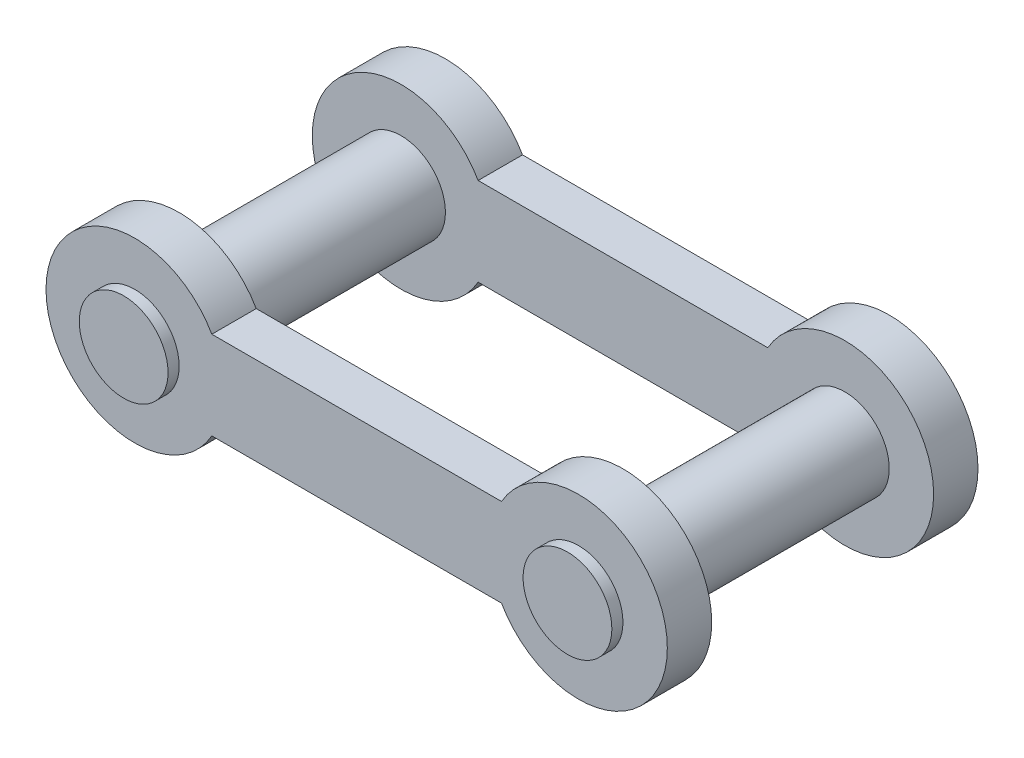
ISO-10303-21;
HEADER;
FILE_DESCRIPTION(('STEP AP214'),'2;1');
FILE_NAME('part.step','',(''),(''),'','','');
FILE_SCHEMA(('AUTOMOTIVE_DESIGN { 1 0 10303 214 1 1 1 1 }'));
ENDSEC;
DATA;
#1=APPLICATION_CONTEXT('core data for automotive mechanical design processes');
#2=APPLICATION_PROTOCOL_DEFINITION('international standard','automotive_design',2000,#1);
#3=PRODUCT_CONTEXT('',#1,'mechanical');
#4=PRODUCT('Part','Part','',(#3));
#5=PRODUCT_RELATED_PRODUCT_CATEGORY('part','',(#4));
#6=PRODUCT_DEFINITION_FORMATION('','',#4);
#7=PRODUCT_DEFINITION_CONTEXT('part definition',#1,'design');
#8=PRODUCT_DEFINITION('design','',#6,#7);
#9=PRODUCT_DEFINITION_SHAPE('','',#8);
#10=(LENGTH_UNIT() NAMED_UNIT(*) SI_UNIT(.MILLI.,.METRE.));
#11=(NAMED_UNIT(*) PLANE_ANGLE_UNIT() SI_UNIT($,.RADIAN.));
#12=(NAMED_UNIT(*) SI_UNIT($,.STERADIAN.) SOLID_ANGLE_UNIT());
#13=UNCERTAINTY_MEASURE_WITH_UNIT(LENGTH_MEASURE(1.E-05),#10,'distance_accuracy_value','');
#14=(GEOMETRIC_REPRESENTATION_CONTEXT(3) GLOBAL_UNCERTAINTY_ASSIGNED_CONTEXT((#13)) GLOBAL_UNIT_ASSIGNED_CONTEXT((#10,
#11,#12)) REPRESENTATION_CONTEXT('',''));
#15=CARTESIAN_POINT('',(0.,0.,0.));
#16=DIRECTION('',(0.,0.,1.));
#17=DIRECTION('',(1.,0.,0.));
#18=AXIS2_PLACEMENT_3D('',#15,#16,#17);
#19=CARTESIAN_POINT('',(-10.,0.,2.));
#20=DIRECTION('',(0.,0.,1.));
#21=DIRECTION('',(1.,0.,0.));
#22=AXIS2_PLACEMENT_3D('',#19,#20,#21);
#23=PLANE('',#22);
#24=CARTESIAN_POINT('',(-10.,0.,2.));
#25=DIRECTION('',(0.,0.,1.));
#26=DIRECTION('',(1.,0.,0.));
#27=AXIS2_PLACEMENT_3D('',#24,#25,#26);
#28=CIRCLE('',#27,2.);
#29=CARTESIAN_POINT('',(-8.,0.,2.));
#30=VERTEX_POINT('',#29);
#31=EDGE_CURVE('E176',#30,#30,#28,.T.);
#32=ORIENTED_EDGE('',*,*,#31,.F.);
#33=EDGE_LOOP('',(#32));
#34=FACE_BOUND('',#33,.T.);
#35=CARTESIAN_POINT('',(-10.,0.,2.));
#36=DIRECTION('',(0.,0.,1.));
#37=DIRECTION('',(1.,0.,0.));
#38=AXIS2_PLACEMENT_3D('',#35,#36,#37);
#39=CIRCLE('',#38,4.);
#40=CARTESIAN_POINT('',(-6.52657961034548,1.98377186105969,2.));
#41=VERTEX_POINT('',#40);
#42=CARTESIAN_POINT('',(-6.52657961034548,-1.98377186105969,2.));
#43=VERTEX_POINT('',#42);
#44=EDGE_CURVE('E180',#41,#43,#39,.T.);
#45=ORIENTED_EDGE('',*,*,#44,.T.);
#46=DIRECTION('',(1.,0.,0.));
#47=VECTOR('',#46,1.);
#48=CARTESIAN_POINT('',(-6.52657961034548,-1.98377186105969,2.));
#49=LINE('',#48,#47);
#50=CARTESIAN_POINT('',(6.52657961034548,-1.98377186105969,2.));
#51=VERTEX_POINT('',#50);
#52=EDGE_CURVE('E84',#43,#51,#49,.T.);
#53=ORIENTED_EDGE('',*,*,#52,.T.);
#54=CARTESIAN_POINT('',(10.,0.,2.));
#55=DIRECTION('',(0.,0.,1.));
#56=DIRECTION('',(-1.,0.,0.));
#57=AXIS2_PLACEMENT_3D('',#54,#55,#56);
#58=CIRCLE('',#57,4.);
#59=CARTESIAN_POINT('',(6.52657961034548,1.98377186105969,2.));
#60=VERTEX_POINT('',#59);
#61=EDGE_CURVE('E183',#51,#60,#58,.T.);
#62=ORIENTED_EDGE('',*,*,#61,.T.);
#63=DIRECTION('',(-1.,0.,0.));
#64=VECTOR('',#63,1.);
#65=CARTESIAN_POINT('',(-6.52657961034548,1.98377186105969,2.));
#66=LINE('',#65,#64);
#67=EDGE_CURVE('E52',#60,#41,#66,.T.);
#68=ORIENTED_EDGE('',*,*,#67,.T.);
#69=EDGE_LOOP('',(#45,#53,#62,#68));
#70=FACE_BOUND('',#69,.T.);
#71=CARTESIAN_POINT('',(10.,0.,2.));
#72=DIRECTION('',(0.,0.,1.));
#73=DIRECTION('',(-1.,0.,0.));
#74=AXIS2_PLACEMENT_3D('',#71,#72,#73);
#75=CIRCLE('',#74,2.);
#76=CARTESIAN_POINT('',(8.,0.,2.));
#77=VERTEX_POINT('',#76);
#78=EDGE_CURVE('E173',#77,#77,#75,.T.);
#79=ORIENTED_EDGE('',*,*,#78,.F.);
#80=EDGE_LOOP('',(#79));
#81=FACE_BOUND('',#80,.T.);
#82=ADVANCED_FACE('F35',(#34,#70,#81),#23,.T.);
#83=CARTESIAN_POINT('',(-10.,0.,0.));
#84=DIRECTION('',(0.,0.,1.));
#85=DIRECTION('',(1.,0.,0.));
#86=AXIS2_PLACEMENT_3D('',#83,#84,#85);
#87=PLANE('',#86);
#88=CARTESIAN_POINT('',(-10.,0.,0.));
#89=DIRECTION('',(0.,0.,1.));
#90=DIRECTION('',(1.,0.,0.));
#91=AXIS2_PLACEMENT_3D('',#88,#89,#90);
#92=CIRCLE('',#91,4.);
#93=CARTESIAN_POINT('',(-6.52657961034548,1.98377186105969,0.));
#94=VERTEX_POINT('',#93);
#95=CARTESIAN_POINT('',(-6.52657961034548,-1.98377186105969,0.));
#96=VERTEX_POINT('',#95);
#97=EDGE_CURVE('E179',#94,#96,#92,.T.);
#98=ORIENTED_EDGE('',*,*,#97,.F.);
#99=DIRECTION('',(-1.,0.,0.));
#100=VECTOR('',#99,1.);
#101=CARTESIAN_POINT('',(-6.52657961034548,1.98377186105969,0.));
#102=LINE('',#101,#100);
#103=CARTESIAN_POINT('',(6.52657961034548,1.98377186105969,0.));
#104=VERTEX_POINT('',#103);
#105=EDGE_CURVE('E76',#104,#94,#102,.T.);
#106=ORIENTED_EDGE('',*,*,#105,.F.);
#107=CARTESIAN_POINT('',(10.,0.,0.));
#108=DIRECTION('',(0.,0.,1.));
#109=DIRECTION('',(-1.,0.,0.));
#110=AXIS2_PLACEMENT_3D('',#107,#108,#109);
#111=CIRCLE('',#110,4.);
#112=CARTESIAN_POINT('',(6.52657961034548,-1.98377186105969,0.));
#113=VERTEX_POINT('',#112);
#114=EDGE_CURVE('E70',#113,#104,#111,.T.);
#115=ORIENTED_EDGE('',*,*,#114,.F.);
#116=DIRECTION('',(1.,0.,0.));
#117=VECTOR('',#116,1.);
#118=CARTESIAN_POINT('',(-6.52657961034548,-1.98377186105969,0.));
#119=LINE('',#118,#117);
#120=EDGE_CURVE('E189',#96,#113,#119,.T.);
#121=ORIENTED_EDGE('',*,*,#120,.F.);
#122=EDGE_LOOP('',(#98,#106,#115,#121));
#123=FACE_BOUND('',#122,.T.);
#124=CARTESIAN_POINT('',(-10.,0.,0.));
#125=DIRECTION('',(0.,0.,1.));
#126=DIRECTION('',(1.,0.,0.));
#127=AXIS2_PLACEMENT_3D('',#124,#125,#126);
#128=CIRCLE('',#127,2.);
#129=CARTESIAN_POINT('',(-8.,0.,0.));
#130=VERTEX_POINT('',#129);
#131=EDGE_CURVE('E161',#130,#130,#128,.T.);
#132=ORIENTED_EDGE('',*,*,#131,.T.);
#133=EDGE_LOOP('',(#132));
#134=FACE_BOUND('',#133,.T.);
#135=CARTESIAN_POINT('',(10.,0.,0.));
#136=DIRECTION('',(0.,0.,1.));
#137=DIRECTION('',(1.,0.,0.));
#138=AXIS2_PLACEMENT_3D('',#135,#136,#137);
#139=CIRCLE('',#138,2.);
#140=CARTESIAN_POINT('',(12.,0.,0.));
#141=VERTEX_POINT('',#140);
#142=EDGE_CURVE('E170',#141,#141,#139,.T.);
#143=ORIENTED_EDGE('',*,*,#142,.T.);
#144=EDGE_LOOP('',(#143));
#145=FACE_BOUND('',#144,.T.);
#146=ADVANCED_FACE('F212',(#123,#134,#145),#87,.F.);
#147=CARTESIAN_POINT('',(-10.,0.,2.));
#148=DIRECTION('',(0.,0.,-1.));
#149=DIRECTION('',(-1.,0.,0.));
#150=AXIS2_PLACEMENT_3D('',#147,#148,#149);
#151=CYLINDRICAL_SURFACE('',#150,4.);
#152=ORIENTED_EDGE('',*,*,#97,.T.);
#153=DIRECTION('',(0.,0.,-1.));
#154=VECTOR('',#153,1.);
#155=CARTESIAN_POINT('',(-6.52657961034548,-1.98377186105969,2.));
#156=LINE('',#155,#154);
#157=EDGE_CURVE('E198',#43,#96,#156,.T.);
#158=ORIENTED_EDGE('',*,*,#157,.F.);
#159=ORIENTED_EDGE('',*,*,#44,.F.);
#160=DIRECTION('',(0.,0.,-1.));
#161=VECTOR('',#160,1.);
#162=CARTESIAN_POINT('',(-6.52657961034548,1.98377186105969,2.));
#163=LINE('',#162,#161);
#164=EDGE_CURVE('E186',#41,#94,#163,.T.);
#165=ORIENTED_EDGE('',*,*,#164,.T.);
#166=EDGE_LOOP('',(#152,#158,#159,#165));
#167=FACE_BOUND('',#166,.T.);
#168=ADVANCED_FACE('F37',(#167),#151,.T.);
#169=CARTESIAN_POINT('',(-6.52657961034548,-1.98377186105969,2.));
#170=DIRECTION('',(0.,1.,0.));
#171=DIRECTION('',(0.,0.,1.));
#172=AXIS2_PLACEMENT_3D('',#169,#170,#171);
#173=PLANE('',#172);
#174=ORIENTED_EDGE('',*,*,#120,.T.);
#175=DIRECTION('',(0.,0.,-1.));
#176=VECTOR('',#175,1.);
#177=CARTESIAN_POINT('',(6.52657961034548,-1.98377186105969,2.));
#178=LINE('',#177,#176);
#179=EDGE_CURVE('E196',#51,#113,#178,.T.);
#180=ORIENTED_EDGE('',*,*,#179,.F.);
#181=ORIENTED_EDGE('',*,*,#52,.F.);
#182=ORIENTED_EDGE('',*,*,#157,.T.);
#183=EDGE_LOOP('',(#174,#180,#181,#182));
#184=FACE_BOUND('',#183,.T.);
#185=ADVANCED_FACE('F297',(#184),#173,.F.);
#186=CARTESIAN_POINT('',(10.,0.,2.));
#187=DIRECTION('',(0.,0.,-1.));
#188=DIRECTION('',(-1.,0.,0.));
#189=AXIS2_PLACEMENT_3D('',#186,#187,#188);
#190=CYLINDRICAL_SURFACE('',#189,4.);
#191=ORIENTED_EDGE('',*,*,#114,.T.);
#192=DIRECTION('',(0.,0.,-1.));
#193=VECTOR('',#192,1.);
#194=CARTESIAN_POINT('',(6.52657961034548,1.98377186105969,2.));
#195=LINE('',#194,#193);
#196=EDGE_CURVE('E194',#60,#104,#195,.T.);
#197=ORIENTED_EDGE('',*,*,#196,.F.);
#198=ORIENTED_EDGE('',*,*,#61,.F.);
#199=ORIENTED_EDGE('',*,*,#179,.T.);
#200=EDGE_LOOP('',(#191,#197,#198,#199));
#201=FACE_BOUND('',#200,.T.);
#202=ADVANCED_FACE('F285',(#201),#190,.T.);
#203=CARTESIAN_POINT('',(-6.52657961034548,1.98377186105969,2.));
#204=DIRECTION('',(0.,-1.,0.));
#205=DIRECTION('',(0.,0.,-1.));
#206=AXIS2_PLACEMENT_3D('',#203,#204,#205);
#207=PLANE('',#206);
#208=ORIENTED_EDGE('',*,*,#105,.T.);
#209=ORIENTED_EDGE('',*,*,#164,.F.);
#210=ORIENTED_EDGE('',*,*,#67,.F.);
#211=ORIENTED_EDGE('',*,*,#196,.T.);
#212=EDGE_LOOP('',(#208,#209,#210,#211));
#213=FACE_BOUND('',#212,.T.);
#214=ADVANCED_FACE('F280',(#213),#207,.F.);
#215=CARTESIAN_POINT('',(10.,0.,-0.5));
#216=DIRECTION('',(0.,0.,1.));
#217=DIRECTION('',(1.,0.,0.));
#218=AXIS2_PLACEMENT_3D('',#215,#216,#217);
#219=PLANE('',#218);
#220=CARTESIAN_POINT('',(10.,0.,-0.5));
#221=DIRECTION('',(0.,0.,1.));
#222=DIRECTION('',(1.,0.,0.));
#223=AXIS2_PLACEMENT_3D('',#220,#221,#222);
#224=CIRCLE('',#223,2.);
#225=CARTESIAN_POINT('',(12.,0.,-0.5));
#226=VERTEX_POINT('',#225);
#227=EDGE_CURVE('E167',#226,#226,#224,.T.);
#228=ORIENTED_EDGE('',*,*,#227,.F.);
#229=EDGE_LOOP('',(#228));
#230=FACE_BOUND('',#229,.T.);
#231=ADVANCED_FACE('F232',(#230),#219,.F.);
#232=CARTESIAN_POINT('',(10.,0.,-0.5));
#233=DIRECTION('',(0.,0.,1.));
#234=DIRECTION('',(1.,0.,0.));
#235=AXIS2_PLACEMENT_3D('',#232,#233,#234);
#236=CYLINDRICAL_SURFACE('',#235,2.);
#237=ORIENTED_EDGE('',*,*,#227,.T.);
#238=EDGE_LOOP('',(#237));
#239=FACE_BOUND('',#238,.T.);
#240=ORIENTED_EDGE('',*,*,#142,.F.);
#241=EDGE_LOOP('',(#240));
#242=FACE_BOUND('',#241,.T.);
#243=ADVANCED_FACE('F222',(#239,#242),#236,.T.);
#244=CARTESIAN_POINT('',(10.,0.,12.));
#245=DIRECTION('',(0.,0.,-1.));
#246=DIRECTION('',(-1.,0.,0.));
#247=AXIS2_PLACEMENT_3D('',#244,#245,#246);
#248=CIRCLE('',#247,2.);
#249=CARTESIAN_POINT('',(8.,0.,12.));
#250=VERTEX_POINT('',#249);
#251=EDGE_CURVE('E11',#250,#250,#248,.F.);
#252=ORIENTED_EDGE('',*,*,#251,.F.);
#253=EDGE_LOOP('',(#252));
#254=FACE_BOUND('',#253,.T.);
#255=ORIENTED_EDGE('',*,*,#78,.T.);
#256=EDGE_LOOP('',(#255));
#257=FACE_BOUND('',#256,.T.);
#258=ADVANCED_FACE('F219',(#254,#257),#236,.T.);
#259=CARTESIAN_POINT('',(-10.,0.,-0.5));
#260=DIRECTION('',(0.,0.,1.));
#261=DIRECTION('',(1.,0.,0.));
#262=AXIS2_PLACEMENT_3D('',#259,#260,#261);
#263=PLANE('',#262);
#264=CARTESIAN_POINT('',(-10.,0.,-0.5));
#265=DIRECTION('',(0.,0.,1.));
#266=DIRECTION('',(1.,0.,0.));
#267=AXIS2_PLACEMENT_3D('',#264,#265,#266);
#268=CIRCLE('',#267,2.);
#269=CARTESIAN_POINT('',(-8.,0.,-0.5));
#270=VERTEX_POINT('',#269);
#271=EDGE_CURVE('E158',#270,#270,#268,.T.);
#272=ORIENTED_EDGE('',*,*,#271,.F.);
#273=EDGE_LOOP('',(#272));
#274=FACE_BOUND('',#273,.T.);
#275=ADVANCED_FACE('F221',(#274),#263,.F.);
#276=CARTESIAN_POINT('',(-10.,0.,-0.5));
#277=DIRECTION('',(0.,0.,1.));
#278=DIRECTION('',(1.,0.,0.));
#279=AXIS2_PLACEMENT_3D('',#276,#277,#278);
#280=CYLINDRICAL_SURFACE('',#279,2.);
#281=ORIENTED_EDGE('',*,*,#271,.T.);
#282=EDGE_LOOP('',(#281));
#283=FACE_BOUND('',#282,.T.);
#284=ORIENTED_EDGE('',*,*,#131,.F.);
#285=EDGE_LOOP('',(#284));
#286=FACE_BOUND('',#285,.T.);
#287=ADVANCED_FACE('F206',(#283,#286),#280,.T.);
#288=CARTESIAN_POINT('',(-10.,0.,12.));
#289=DIRECTION('',(0.,0.,-1.));
#290=DIRECTION('',(-1.,0.,0.));
#291=AXIS2_PLACEMENT_3D('',#288,#289,#290);
#292=CIRCLE('',#291,2.);
#293=CARTESIAN_POINT('',(-12.,0.,12.));
#294=VERTEX_POINT('',#293);
#295=EDGE_CURVE('E44',#294,#294,#292,.F.);
#296=ORIENTED_EDGE('',*,*,#295,.F.);
#297=EDGE_LOOP('',(#296));
#298=FACE_BOUND('',#297,.T.);
#299=ORIENTED_EDGE('',*,*,#31,.T.);
#300=EDGE_LOOP('',(#299));
#301=FACE_BOUND('',#300,.T.);
#302=ADVANCED_FACE('F203',(#298,#301),#280,.T.);
#303=CARTESIAN_POINT('',(-10.,0.,12.));
#304=DIRECTION('',(0.,0.,1.));
#305=DIRECTION('',(1.,0.,0.));
#306=AXIS2_PLACEMENT_3D('',#303,#304,#305);
#307=CYLINDRICAL_SURFACE('',#306,4.);
#308=CARTESIAN_POINT('',(-10.,0.,14.));
#309=DIRECTION('',(0.,0.,1.));
#310=DIRECTION('',(1.,0.,0.));
#311=AXIS2_PLACEMENT_3D('',#308,#309,#310);
#312=CIRCLE('',#311,4.);
#313=CARTESIAN_POINT('',(-6.52657961034548,1.98377186105969,14.));
#314=VERTEX_POINT('',#313);
#315=CARTESIAN_POINT('',(-6.52657961034548,-1.98377186105969,14.));
#316=VERTEX_POINT('',#315);
#317=EDGE_CURVE('E117',#314,#316,#312,.T.);
#318=ORIENTED_EDGE('',*,*,#317,.F.);
#319=DIRECTION('',(0.,0.,1.));
#320=VECTOR('',#319,1.);
#321=CARTESIAN_POINT('',(-6.52657961034548,1.98377186105969,12.));
#322=LINE('',#321,#320);
#323=CARTESIAN_POINT('',(-6.52657961034548,1.98377186105969,12.));
#324=VERTEX_POINT('',#323);
#325=EDGE_CURVE('E111',#324,#314,#322,.T.);
#326=ORIENTED_EDGE('',*,*,#325,.F.);
#327=CARTESIAN_POINT('',(-10.,0.,12.));
#328=DIRECTION('',(0.,0.,1.));
#329=DIRECTION('',(1.,0.,0.));
#330=AXIS2_PLACEMENT_3D('',#327,#328,#329);
#331=CIRCLE('',#330,4.);
#332=CARTESIAN_POINT('',(-6.52657961034548,-1.98377186105969,12.));
#333=VERTEX_POINT('',#332);
#334=EDGE_CURVE('E114',#324,#333,#331,.T.);
#335=ORIENTED_EDGE('',*,*,#334,.T.);
#336=DIRECTION('',(0.,0.,1.));
#337=VECTOR('',#336,1.);
#338=CARTESIAN_POINT('',(-6.52657961034548,-1.98377186105969,12.));
#339=LINE('',#338,#337);
#340=EDGE_CURVE('E142',#333,#316,#339,.T.);
#341=ORIENTED_EDGE('',*,*,#340,.T.);
#342=EDGE_LOOP('',(#318,#326,#335,#341));
#343=FACE_BOUND('',#342,.T.);
#344=ADVANCED_FACE('F113',(#343),#307,.T.);
#345=CARTESIAN_POINT('',(-6.52657961034548,1.98377186105969,12.));
#346=DIRECTION('',(0.,1.,0.));
#347=DIRECTION('',(0.,0.,1.));
#348=AXIS2_PLACEMENT_3D('',#345,#346,#347);
#349=PLANE('',#348);
#350=DIRECTION('',(-1.,0.,0.));
#351=VECTOR('',#350,1.);
#352=CARTESIAN_POINT('',(-6.52657961034548,1.98377186105969,14.));
#353=LINE('',#352,#351);
#354=CARTESIAN_POINT('',(6.52657961034548,1.98377186105969,14.));
#355=VERTEX_POINT('',#354);
#356=EDGE_CURVE('E144',#355,#314,#353,.T.);
#357=ORIENTED_EDGE('',*,*,#356,.F.);
#358=DIRECTION('',(0.,0.,1.));
#359=VECTOR('',#358,1.);
#360=CARTESIAN_POINT('',(6.52657961034548,1.98377186105969,12.));
#361=LINE('',#360,#359);
#362=CARTESIAN_POINT('',(6.52657961034548,1.98377186105969,12.));
#363=VERTEX_POINT('',#362);
#364=EDGE_CURVE('E123',#363,#355,#361,.T.);
#365=ORIENTED_EDGE('',*,*,#364,.F.);
#366=DIRECTION('',(-1.,0.,0.));
#367=VECTOR('',#366,1.);
#368=CARTESIAN_POINT('',(-6.52657961034548,1.98377186105969,12.));
#369=LINE('',#368,#367);
#370=EDGE_CURVE('E129',#363,#324,#369,.T.);
#371=ORIENTED_EDGE('',*,*,#370,.T.);
#372=ORIENTED_EDGE('',*,*,#325,.T.);
#373=EDGE_LOOP('',(#357,#365,#371,#372));
#374=FACE_BOUND('',#373,.T.);
#375=ADVANCED_FACE('F135',(#374),#349,.T.);
#376=CARTESIAN_POINT('',(10.,0.,12.));
#377=DIRECTION('',(0.,0.,1.));
#378=DIRECTION('',(1.,0.,0.));
#379=AXIS2_PLACEMENT_3D('',#376,#377,#378);
#380=CYLINDRICAL_SURFACE('',#379,4.);
#381=CARTESIAN_POINT('',(10.,0.,14.));
#382=DIRECTION('',(0.,0.,1.));
#383=DIRECTION('',(-1.,0.,0.));
#384=AXIS2_PLACEMENT_3D('',#381,#382,#383);
#385=CIRCLE('',#384,4.);
#386=CARTESIAN_POINT('',(6.52657961034548,-1.98377186105969,14.));
#387=VERTEX_POINT('',#386);
#388=EDGE_CURVE('E147',#387,#355,#385,.T.);
#389=ORIENTED_EDGE('',*,*,#388,.F.);
#390=DIRECTION('',(0.,0.,1.));
#391=VECTOR('',#390,1.);
#392=CARTESIAN_POINT('',(6.52657961034548,-1.98377186105969,12.));
#393=LINE('',#392,#391);
#394=CARTESIAN_POINT('',(6.52657961034548,-1.98377186105969,12.));
#395=VERTEX_POINT('',#394);
#396=EDGE_CURVE('E153',#395,#387,#393,.T.);
#397=ORIENTED_EDGE('',*,*,#396,.F.);
#398=CARTESIAN_POINT('',(10.,0.,12.));
#399=DIRECTION('',(0.,0.,1.));
#400=DIRECTION('',(-1.,0.,0.));
#401=AXIS2_PLACEMENT_3D('',#398,#399,#400);
#402=CIRCLE('',#401,4.);
#403=EDGE_CURVE('E136',#395,#363,#402,.T.);
#404=ORIENTED_EDGE('',*,*,#403,.T.);
#405=ORIENTED_EDGE('',*,*,#364,.T.);
#406=EDGE_LOOP('',(#389,#397,#404,#405));
#407=FACE_BOUND('',#406,.T.);
#408=ADVANCED_FACE('F268',(#407),#380,.T.);
#409=CARTESIAN_POINT('',(-6.52657961034548,-1.98377186105969,12.));
#410=DIRECTION('',(0.,-1.,0.));
#411=DIRECTION('',(0.,0.,-1.));
#412=AXIS2_PLACEMENT_3D('',#409,#410,#411);
#413=PLANE('',#412);
#414=DIRECTION('',(1.,0.,0.));
#415=VECTOR('',#414,1.);
#416=CARTESIAN_POINT('',(-6.52657961034548,-1.98377186105969,14.));
#417=LINE('',#416,#415);
#418=EDGE_CURVE('E133',#316,#387,#417,.T.);
#419=ORIENTED_EDGE('',*,*,#418,.F.);
#420=ORIENTED_EDGE('',*,*,#340,.F.);
#421=DIRECTION('',(1.,0.,0.));
#422=VECTOR('',#421,1.);
#423=CARTESIAN_POINT('',(-6.52657961034548,-1.98377186105969,12.));
#424=LINE('',#423,#422);
#425=EDGE_CURVE('E132',#333,#395,#424,.T.);
#426=ORIENTED_EDGE('',*,*,#425,.T.);
#427=ORIENTED_EDGE('',*,*,#396,.T.);
#428=EDGE_LOOP('',(#419,#420,#426,#427));
#429=FACE_BOUND('',#428,.T.);
#430=ADVANCED_FACE('F265',(#429),#413,.T.);
#431=CARTESIAN_POINT('',(-10.,0.,12.));
#432=DIRECTION('',(0.,0.,-1.));
#433=DIRECTION('',(1.,0.,0.));
#434=AXIS2_PLACEMENT_3D('',#431,#432,#433);
#435=PLANE('',#434);
#436=ORIENTED_EDGE('',*,*,#251,.T.);
#437=EDGE_LOOP('',(#436));
#438=FACE_BOUND('',#437,.T.);
#439=ORIENTED_EDGE('',*,*,#295,.T.);
#440=EDGE_LOOP('',(#439));
#441=FACE_BOUND('',#440,.T.);
#442=ORIENTED_EDGE('',*,*,#334,.F.);
#443=ORIENTED_EDGE('',*,*,#370,.F.);
#444=ORIENTED_EDGE('',*,*,#403,.F.);
#445=ORIENTED_EDGE('',*,*,#425,.F.);
#446=EDGE_LOOP('',(#442,#443,#444,#445));
#447=FACE_BOUND('',#446,.T.);
#448=ADVANCED_FACE('F127',(#438,#441,#447),#435,.T.);
#449=CARTESIAN_POINT('',(-10.,0.,14.));
#450=DIRECTION('',(0.,0.,-1.));
#451=DIRECTION('',(1.,0.,0.));
#452=AXIS2_PLACEMENT_3D('',#449,#450,#451);
#453=PLANE('',#452);
#454=CARTESIAN_POINT('',(10.,0.,14.));
#455=DIRECTION('',(0.,0.,1.));
#456=DIRECTION('',(-1.,0.,0.));
#457=AXIS2_PLACEMENT_3D('',#454,#455,#456);
#458=CIRCLE('',#457,2.);
#459=CARTESIAN_POINT('',(8.,0.,14.));
#460=VERTEX_POINT('',#459);
#461=EDGE_CURVE('E253',#460,#460,#458,.T.);
#462=ORIENTED_EDGE('',*,*,#461,.F.);
#463=EDGE_LOOP('',(#462));
#464=FACE_BOUND('',#463,.T.);
#465=CARTESIAN_POINT('',(-10.,0.,14.));
#466=DIRECTION('',(0.,0.,1.));
#467=DIRECTION('',(1.,0.,0.));
#468=AXIS2_PLACEMENT_3D('',#465,#466,#467);
#469=CIRCLE('',#468,2.);
#470=CARTESIAN_POINT('',(-8.,0.,14.));
#471=VERTEX_POINT('',#470);
#472=EDGE_CURVE('E145',#471,#471,#469,.T.);
#473=ORIENTED_EDGE('',*,*,#472,.F.);
#474=EDGE_LOOP('',(#473));
#475=FACE_BOUND('',#474,.T.);
#476=ORIENTED_EDGE('',*,*,#317,.T.);
#477=ORIENTED_EDGE('',*,*,#418,.T.);
#478=ORIENTED_EDGE('',*,*,#388,.T.);
#479=ORIENTED_EDGE('',*,*,#356,.T.);
#480=EDGE_LOOP('',(#476,#477,#478,#479));
#481=FACE_BOUND('',#480,.T.);
#482=ADVANCED_FACE('F246',(#464,#475,#481),#453,.F.);
#483=CARTESIAN_POINT('',(10.,0.,14.5));
#484=DIRECTION('',(0.,0.,1.));
#485=DIRECTION('',(1.,0.,0.));
#486=AXIS2_PLACEMENT_3D('',#483,#484,#485);
#487=PLANE('',#486);
#488=CARTESIAN_POINT('',(10.,0.,14.5));
#489=DIRECTION('',(0.,0.,1.));
#490=DIRECTION('',(1.,0.,0.));
#491=AXIS2_PLACEMENT_3D('',#488,#489,#490);
#492=CIRCLE('',#491,2.);
#493=CARTESIAN_POINT('',(12.,0.,14.5));
#494=VERTEX_POINT('',#493);
#495=EDGE_CURVE('E164',#494,#494,#492,.T.);
#496=ORIENTED_EDGE('',*,*,#495,.T.);
#497=EDGE_LOOP('',(#496));
#498=FACE_BOUND('',#497,.T.);
#499=ADVANCED_FACE('F238',(#498),#487,.T.);
#500=ORIENTED_EDGE('',*,*,#495,.F.);
#501=EDGE_LOOP('',(#500));
#502=FACE_BOUND('',#501,.T.);
#503=ORIENTED_EDGE('',*,*,#461,.T.);
#504=EDGE_LOOP('',(#503));
#505=FACE_BOUND('',#504,.T.);
#506=ADVANCED_FACE('F225',(#502,#505),#236,.T.);
#507=CARTESIAN_POINT('',(-10.,0.,14.5));
#508=DIRECTION('',(0.,0.,1.));
#509=DIRECTION('',(1.,0.,0.));
#510=AXIS2_PLACEMENT_3D('',#507,#508,#509);
#511=PLANE('',#510);
#512=CARTESIAN_POINT('',(-10.,0.,14.5));
#513=DIRECTION('',(0.,0.,1.));
#514=DIRECTION('',(1.,0.,0.));
#515=AXIS2_PLACEMENT_3D('',#512,#513,#514);
#516=CIRCLE('',#515,2.);
#517=CARTESIAN_POINT('',(-8.,0.,14.5));
#518=VERTEX_POINT('',#517);
#519=EDGE_CURVE('E122',#518,#518,#516,.T.);
#520=ORIENTED_EDGE('',*,*,#519,.T.);
#521=EDGE_LOOP('',(#520));
#522=FACE_BOUND('',#521,.T.);
#523=ADVANCED_FACE('F237',(#522),#511,.T.);
#524=ORIENTED_EDGE('',*,*,#519,.F.);
#525=EDGE_LOOP('',(#524));
#526=FACE_BOUND('',#525,.T.);
#527=ORIENTED_EDGE('',*,*,#472,.T.);
#528=EDGE_LOOP('',(#527));
#529=FACE_BOUND('',#528,.T.);
#530=ADVANCED_FACE('F208',(#526,#529),#280,.T.);
#531=CLOSED_SHELL('',(#82,#146,#168,#185,#202,#214,#231,#243,#258,#275,#287,#302,#344,#375,#408,
#430,#448,#482,#499,#506,#523,#530));
#532=MANIFOLD_SOLID_BREP('B2',#531);
#533=ADVANCED_BREP_SHAPE_REPRESENTATION('',(#18,#532),#14);
#534=SHAPE_DEFINITION_REPRESENTATION(#9,#533);
ENDSEC;
END-ISO-10303-21;
